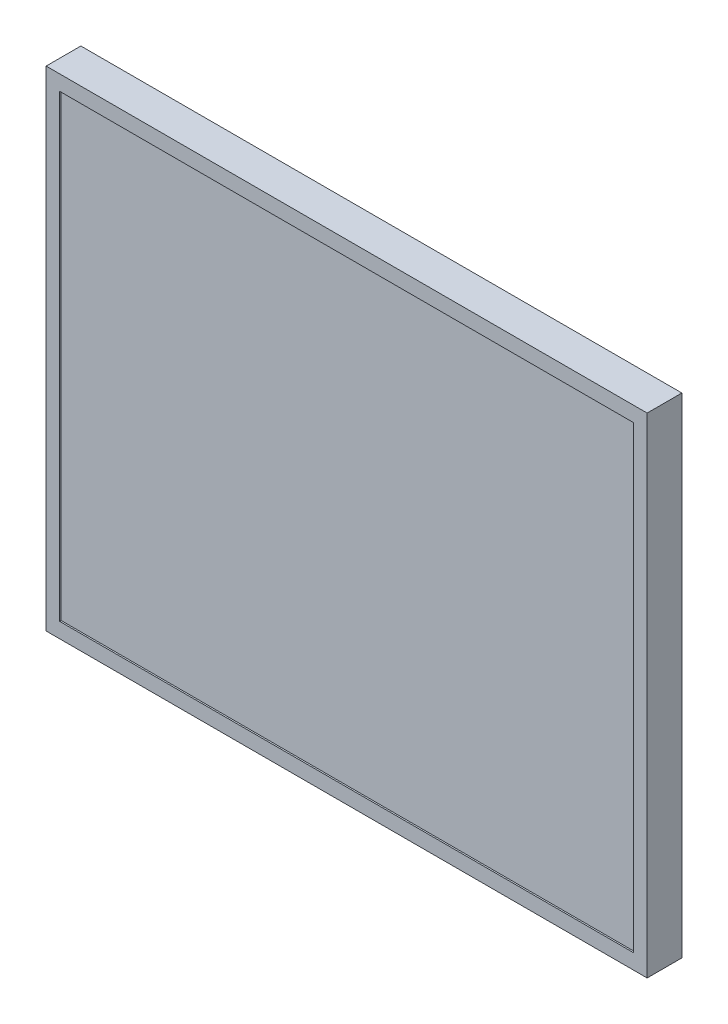
ISO-10303-21;
HEADER;
FILE_DESCRIPTION(('STEP AP214'),'2;1');
FILE_NAME('part.step','',(''),(''),'','','');
FILE_SCHEMA(('AUTOMOTIVE_DESIGN { 1 0 10303 214 1 1 1 1 }'));
ENDSEC;
DATA;
#1=APPLICATION_CONTEXT('core data for automotive mechanical design processes');
#2=APPLICATION_PROTOCOL_DEFINITION('international standard','automotive_design',2000,#1);
#3=PRODUCT_CONTEXT('',#1,'mechanical');
#4=PRODUCT('Part','Part','',(#3));
#5=PRODUCT_RELATED_PRODUCT_CATEGORY('part','',(#4));
#6=PRODUCT_DEFINITION_FORMATION('','',#4);
#7=PRODUCT_DEFINITION_CONTEXT('part definition',#1,'design');
#8=PRODUCT_DEFINITION('design','',#6,#7);
#9=PRODUCT_DEFINITION_SHAPE('','',#8);
#10=(LENGTH_UNIT() NAMED_UNIT(*) SI_UNIT(.MILLI.,.METRE.));
#11=(NAMED_UNIT(*) PLANE_ANGLE_UNIT() SI_UNIT($,.RADIAN.));
#12=(NAMED_UNIT(*) SI_UNIT($,.STERADIAN.) SOLID_ANGLE_UNIT());
#13=UNCERTAINTY_MEASURE_WITH_UNIT(LENGTH_MEASURE(1.E-05),#10,'distance_accuracy_value','');
#14=(GEOMETRIC_REPRESENTATION_CONTEXT(3) GLOBAL_UNCERTAINTY_ASSIGNED_CONTEXT((#13)) GLOBAL_UNIT_ASSIGNED_CONTEXT((#10,
#11,#12)) REPRESENTATION_CONTEXT('',''));
#15=CARTESIAN_POINT('',(0.,0.,0.));
#16=DIRECTION('',(0.,0.,1.));
#17=DIRECTION('',(1.,0.,0.));
#18=AXIS2_PLACEMENT_3D('',#15,#16,#17);
#19=CARTESIAN_POINT('',(374.,79.,-30.));
#20=DIRECTION('',(0.,1.,0.));
#21=DIRECTION('',(0.,0.,1.));
#22=AXIS2_PLACEMENT_3D('',#19,#20,#21);
#23=PLANE('',#22);
#24=DIRECTION('',(0.,0.,-1.));
#25=VECTOR('',#24,1.);
#26=CARTESIAN_POINT('',(99.,79.,-20.));
#27=LINE('',#26,#25);
#28=CARTESIAN_POINT('',(99.,79.,-10.));
#29=VERTEX_POINT('',#28);
#30=CARTESIAN_POINT('',(98.9999999999999,79.,-20.));
#31=VERTEX_POINT('',#30);
#32=EDGE_CURVE('E281',#29,#31,#27,.T.);
#33=ORIENTED_EDGE('',*,*,#32,.F.);
#34=DIRECTION('',(-1.,0.,0.));
#35=VECTOR('',#34,1.);
#36=CARTESIAN_POINT('',(99.,79.,-10.));
#37=LINE('',#36,#35);
#38=CARTESIAN_POINT('',(134.,79.,-9.99999999999999));
#39=VERTEX_POINT('',#38);
#40=EDGE_CURVE('E286',#39,#29,#37,.T.);
#41=ORIENTED_EDGE('',*,*,#40,.F.);
#42=DIRECTION('',(0.,0.,1.));
#43=VECTOR('',#42,1.);
#44=CARTESIAN_POINT('',(134.,79.,-20.));
#45=LINE('',#44,#43);
#46=CARTESIAN_POINT('',(134.,79.,-20.));
#47=VERTEX_POINT('',#46);
#48=EDGE_CURVE('E298',#47,#39,#45,.T.);
#49=ORIENTED_EDGE('',*,*,#48,.F.);
#50=DIRECTION('',(1.,0.,0.));
#51=VECTOR('',#50,1.);
#52=CARTESIAN_POINT('',(99.,79.,-20.));
#53=LINE('',#52,#51);
#54=EDGE_CURVE('E295',#31,#47,#53,.T.);
#55=ORIENTED_EDGE('',*,*,#54,.F.);
#56=EDGE_LOOP('',(#33,#41,#49,#55));
#57=FACE_BOUND('',#56,.T.);
#58=DIRECTION('',(-1.,0.,0.));
#59=VECTOR('',#58,1.);
#60=CARTESIAN_POINT('',(374.,79.,-30.));
#61=LINE('',#60,#59);
#62=CARTESIAN_POINT('',(344.,79.,-30.));
#63=VERTEX_POINT('',#62);
#64=CARTESIAN_POINT('',(52.,79.,-30.));
#65=VERTEX_POINT('',#64);
#66=EDGE_CURVE('E348',#63,#65,#61,.T.);
#67=ORIENTED_EDGE('',*,*,#66,.F.);
#68=DIRECTION('',(-0.832050294337844,0.,-0.554700196225228));
#69=VECTOR('',#68,1.);
#70=CARTESIAN_POINT('',(344.,79.,-30.));
#71=LINE('',#70,#69);
#72=CARTESIAN_POINT('',(374.,79.,-9.99999999999998));
#73=VERTEX_POINT('',#72);
#74=EDGE_CURVE('E440',#63,#73,#71,.F.);
#75=ORIENTED_EDGE('',*,*,#74,.T.);
#76=DIRECTION('',(0.,0.,1.));
#77=VECTOR('',#76,1.);
#78=CARTESIAN_POINT('',(374.,79.,-30.));
#79=LINE('',#78,#77);
#80=CARTESIAN_POINT('',(374.,79.,0.));
#81=VERTEX_POINT('',#80);
#82=EDGE_CURVE('E373',#73,#81,#79,.T.);
#83=ORIENTED_EDGE('',*,*,#82,.T.);
#84=DIRECTION('',(-1.,0.,0.));
#85=VECTOR('',#84,1.);
#86=CARTESIAN_POINT('',(374.,79.,0.));
#87=LINE('',#86,#85);
#88=CARTESIAN_POINT('',(52.,79.,0.));
#89=VERTEX_POINT('',#88);
#90=EDGE_CURVE('E360',#81,#89,#87,.T.);
#91=ORIENTED_EDGE('',*,*,#90,.T.);
#92=DIRECTION('',(0.,0.,1.));
#93=VECTOR('',#92,1.);
#94=CARTESIAN_POINT('',(52.,79.,-30.));
#95=LINE('',#94,#93);
#96=EDGE_CURVE('E370',#65,#89,#95,.T.);
#97=ORIENTED_EDGE('',*,*,#96,.F.);
#98=EDGE_LOOP('',(#67,#75,#83,#91,#97));
#99=FACE_BOUND('',#98,.T.);
#100=DIRECTION('',(0.,0.,-1.));
#101=VECTOR('',#100,1.);
#102=CARTESIAN_POINT('',(54.,79.,-20.));
#103=LINE('',#102,#101);
#104=CARTESIAN_POINT('',(54.,79.,-10.));
#105=VERTEX_POINT('',#104);
#106=CARTESIAN_POINT('',(54.,79.,-20.));
#107=VERTEX_POINT('',#106);
#108=EDGE_CURVE('E314',#105,#107,#103,.T.);
#109=ORIENTED_EDGE('',*,*,#108,.F.);
#110=DIRECTION('',(-1.,0.,0.));
#111=VECTOR('',#110,1.);
#112=CARTESIAN_POINT('',(54.,79.,-10.));
#113=LINE('',#112,#111);
#114=CARTESIAN_POINT('',(84.,79.,-9.99999999999999));
#115=VERTEX_POINT('',#114);
#116=EDGE_CURVE('E319',#115,#105,#113,.T.);
#117=ORIENTED_EDGE('',*,*,#116,.F.);
#118=DIRECTION('',(0.,0.,1.));
#119=VECTOR('',#118,1.);
#120=CARTESIAN_POINT('',(84.,79.,-20.));
#121=LINE('',#120,#119);
#122=CARTESIAN_POINT('',(84.,79.,-20.));
#123=VERTEX_POINT('',#122);
#124=EDGE_CURVE('E331',#123,#115,#121,.T.);
#125=ORIENTED_EDGE('',*,*,#124,.F.);
#126=DIRECTION('',(1.,0.,0.));
#127=VECTOR('',#126,1.);
#128=CARTESIAN_POINT('',(54.,79.,-20.));
#129=LINE('',#128,#127);
#130=EDGE_CURVE('E328',#107,#123,#129,.T.);
#131=ORIENTED_EDGE('',*,*,#130,.F.);
#132=EDGE_LOOP('',(#109,#117,#125,#131));
#133=FACE_BOUND('',#132,.T.);
#134=DIRECTION('',(0.,0.,1.));
#135=VECTOR('',#134,1.);
#136=CARTESIAN_POINT('',(319.,79.,-28.));
#137=LINE('',#136,#135);
#138=CARTESIAN_POINT('',(319.,79.,-28.));
#139=VERTEX_POINT('',#138);
#140=CARTESIAN_POINT('',(319.,79.,-2.));
#141=VERTEX_POINT('',#140);
#142=EDGE_CURVE('E261',#139,#141,#137,.T.);
#143=ORIENTED_EDGE('',*,*,#142,.F.);
#144=DIRECTION('',(1.,0.,0.));
#145=VECTOR('',#144,1.);
#146=CARTESIAN_POINT('',(319.,79.,-28.));
#147=LINE('',#146,#145);
#148=CARTESIAN_POINT('',(289.,79.,-28.));
#149=VERTEX_POINT('',#148);
#150=EDGE_CURVE('E254',#149,#139,#147,.T.);
#151=ORIENTED_EDGE('',*,*,#150,.F.);
#152=DIRECTION('',(0.,0.,-1.));
#153=VECTOR('',#152,1.);
#154=CARTESIAN_POINT('',(289.,79.,-28.));
#155=LINE('',#154,#153);
#156=CARTESIAN_POINT('',(289.,79.,-2.));
#157=VERTEX_POINT('',#156);
#158=EDGE_CURVE('E266',#157,#149,#155,.T.);
#159=ORIENTED_EDGE('',*,*,#158,.F.);
#160=DIRECTION('',(-1.,0.,0.));
#161=VECTOR('',#160,1.);
#162=CARTESIAN_POINT('',(319.,79.,-2.));
#163=LINE('',#162,#161);
#164=EDGE_CURVE('E55',#141,#157,#163,.T.);
#165=ORIENTED_EDGE('',*,*,#164,.F.);
#166=EDGE_LOOP('',(#143,#151,#159,#165));
#167=FACE_BOUND('',#166,.T.);
#168=ADVANCED_FACE('F32',(#57,#99,#133,#167),#23,.F.);
#169=CARTESIAN_POINT('',(0.,0.,0.));
#170=DIRECTION('',(0.,0.,-1.));
#171=DIRECTION('',(-1.,0.,0.));
#172=AXIS2_PLACEMENT_3D('',#169,#170,#171);
#173=PLANE('',#172);
#174=DIRECTION('',(0.,-1.,0.));
#175=VECTOR('',#174,1.);
#176=CARTESIAN_POINT('',(0.,0.,0.));
#177=LINE('',#176,#175);
#178=CARTESIAN_POINT('',(0.,324.,0.));
#179=VERTEX_POINT('',#178);
#180=CARTESIAN_POINT('',(0.,0.,0.));
#181=VERTEX_POINT('',#180);
#182=EDGE_CURVE('E401',#179,#181,#177,.T.);
#183=ORIENTED_EDGE('',*,*,#182,.F.);
#184=DIRECTION('',(-1.,0.,0.));
#185=VECTOR('',#184,1.);
#186=CARTESIAN_POINT('',(0.,324.,0.));
#187=LINE('',#186,#185);
#188=CARTESIAN_POINT('',(398.,324.,0.));
#189=VERTEX_POINT('',#188);
#190=EDGE_CURVE('E412',#189,#179,#187,.T.);
#191=ORIENTED_EDGE('',*,*,#190,.F.);
#192=DIRECTION('',(0.,1.,0.));
#193=VECTOR('',#192,1.);
#194=CARTESIAN_POINT('',(398.,0.,0.));
#195=LINE('',#194,#193);
#196=CARTESIAN_POINT('',(398.,0.,0.));
#197=VERTEX_POINT('',#196);
#198=EDGE_CURVE('E423',#197,#189,#195,.T.);
#199=ORIENTED_EDGE('',*,*,#198,.F.);
#200=DIRECTION('',(1.,0.,0.));
#201=VECTOR('',#200,1.);
#202=CARTESIAN_POINT('',(0.,0.,0.));
#203=LINE('',#202,#201);
#204=EDGE_CURVE('E421',#181,#197,#203,.T.);
#205=ORIENTED_EDGE('',*,*,#204,.F.);
#206=EDGE_LOOP('',(#183,#191,#199,#205));
#207=FACE_BOUND('',#206,.T.);
#208=ORIENTED_EDGE('',*,*,#90,.F.);
#209=DIRECTION('',(0.,-1.,0.));
#210=VECTOR('',#209,1.);
#211=CARTESIAN_POINT('',(374.,79.,0.));
#212=LINE('',#211,#210);
#213=CARTESIAN_POINT('',(374.,241.,0.));
#214=VERTEX_POINT('',#213);
#215=EDGE_CURVE('E347',#214,#81,#212,.T.);
#216=ORIENTED_EDGE('',*,*,#215,.F.);
#217=DIRECTION('',(1.,0.,0.));
#218=VECTOR('',#217,1.);
#219=CARTESIAN_POINT('',(374.,241.,0.));
#220=LINE('',#219,#218);
#221=CARTESIAN_POINT('',(52.,241.,0.));
#222=VERTEX_POINT('',#221);
#223=EDGE_CURVE('E350',#222,#214,#220,.T.);
#224=ORIENTED_EDGE('',*,*,#223,.F.);
#225=DIRECTION('',(0.,1.,0.));
#226=VECTOR('',#225,1.);
#227=CARTESIAN_POINT('',(52.,79.,0.));
#228=LINE('',#227,#226);
#229=EDGE_CURVE('E362',#89,#222,#228,.T.);
#230=ORIENTED_EDGE('',*,*,#229,.F.);
#231=EDGE_LOOP('',(#208,#216,#224,#230));
#232=FACE_BOUND('',#231,.T.);
#233=ADVANCED_FACE('F478',(#207,#232),#173,.T.);
#234=CARTESIAN_POINT('',(0.,0.,23.));
#235=DIRECTION('',(1.,0.,0.));
#236=DIRECTION('',(0.,0.,-1.));
#237=AXIS2_PLACEMENT_3D('',#234,#235,#236);
#238=PLANE('',#237);
#239=ORIENTED_EDGE('',*,*,#182,.T.);
#240=DIRECTION('',(0.,0.,-1.));
#241=VECTOR('',#240,1.);
#242=CARTESIAN_POINT('',(0.,0.,23.));
#243=LINE('',#242,#241);
#244=CARTESIAN_POINT('',(0.,0.,23.));
#245=VERTEX_POINT('',#244);
#246=EDGE_CURVE('E434',#245,#181,#243,.T.);
#247=ORIENTED_EDGE('',*,*,#246,.F.);
#248=DIRECTION('',(0.,-1.,0.));
#249=VECTOR('',#248,1.);
#250=CARTESIAN_POINT('',(0.,0.,23.));
#251=LINE('',#250,#249);
#252=CARTESIAN_POINT('',(0.,324.,23.));
#253=VERTEX_POINT('',#252);
#254=EDGE_CURVE('E408',#253,#245,#251,.T.);
#255=ORIENTED_EDGE('',*,*,#254,.F.);
#256=DIRECTION('',(0.,0.,-1.));
#257=VECTOR('',#256,1.);
#258=CARTESIAN_POINT('',(0.,324.,23.));
#259=LINE('',#258,#257);
#260=EDGE_CURVE('E418',#253,#179,#259,.T.);
#261=ORIENTED_EDGE('',*,*,#260,.T.);
#262=EDGE_LOOP('',(#239,#247,#255,#261));
#263=FACE_BOUND('',#262,.T.);
#264=ADVANCED_FACE('F480',(#263),#238,.F.);
#265=CARTESIAN_POINT('',(0.,0.,23.));
#266=DIRECTION('',(0.,1.,0.));
#267=DIRECTION('',(0.,0.,1.));
#268=AXIS2_PLACEMENT_3D('',#265,#266,#267);
#269=PLANE('',#268);
#270=ORIENTED_EDGE('',*,*,#204,.T.);
#271=DIRECTION('',(0.,0.,-1.));
#272=VECTOR('',#271,1.);
#273=CARTESIAN_POINT('',(398.,0.,23.));
#274=LINE('',#273,#272);
#275=CARTESIAN_POINT('',(398.,0.,23.));
#276=VERTEX_POINT('',#275);
#277=EDGE_CURVE('E431',#276,#197,#274,.T.);
#278=ORIENTED_EDGE('',*,*,#277,.F.);
#279=DIRECTION('',(1.,0.,0.));
#280=VECTOR('',#279,1.);
#281=CARTESIAN_POINT('',(0.,0.,23.));
#282=LINE('',#281,#280);
#283=EDGE_CURVE('E411',#245,#276,#282,.T.);
#284=ORIENTED_EDGE('',*,*,#283,.F.);
#285=ORIENTED_EDGE('',*,*,#246,.T.);
#286=EDGE_LOOP('',(#270,#278,#284,#285));
#287=FACE_BOUND('',#286,.T.);
#288=ADVANCED_FACE('F487',(#287),#269,.F.);
#289=CARTESIAN_POINT('',(398.,0.,23.));
#290=DIRECTION('',(-1.,0.,0.));
#291=DIRECTION('',(0.,0.,1.));
#292=AXIS2_PLACEMENT_3D('',#289,#290,#291);
#293=PLANE('',#292);
#294=ORIENTED_EDGE('',*,*,#198,.T.);
#295=DIRECTION('',(0.,0.,-1.));
#296=VECTOR('',#295,1.);
#297=CARTESIAN_POINT('',(398.,324.,23.));
#298=LINE('',#297,#296);
#299=CARTESIAN_POINT('',(398.,324.,23.));
#300=VERTEX_POINT('',#299);
#301=EDGE_CURVE('E428',#300,#189,#298,.T.);
#302=ORIENTED_EDGE('',*,*,#301,.F.);
#303=DIRECTION('',(0.,1.,0.));
#304=VECTOR('',#303,1.);
#305=CARTESIAN_POINT('',(398.,0.,23.));
#306=LINE('',#305,#304);
#307=EDGE_CURVE('E414',#276,#300,#306,.T.);
#308=ORIENTED_EDGE('',*,*,#307,.F.);
#309=ORIENTED_EDGE('',*,*,#277,.T.);
#310=EDGE_LOOP('',(#294,#302,#308,#309));
#311=FACE_BOUND('',#310,.T.);
#312=ADVANCED_FACE('F499',(#311),#293,.F.);
#313=CARTESIAN_POINT('',(0.,324.,23.));
#314=DIRECTION('',(0.,-1.,0.));
#315=DIRECTION('',(0.,0.,-1.));
#316=AXIS2_PLACEMENT_3D('',#313,#314,#315);
#317=PLANE('',#316);
#318=ORIENTED_EDGE('',*,*,#190,.T.);
#319=ORIENTED_EDGE('',*,*,#260,.F.);
#320=DIRECTION('',(-1.,0.,0.));
#321=VECTOR('',#320,1.);
#322=CARTESIAN_POINT('',(0.,324.,23.));
#323=LINE('',#322,#321);
#324=EDGE_CURVE('E416',#300,#253,#323,.T.);
#325=ORIENTED_EDGE('',*,*,#324,.F.);
#326=ORIENTED_EDGE('',*,*,#301,.T.);
#327=EDGE_LOOP('',(#318,#319,#325,#326));
#328=FACE_BOUND('',#327,.T.);
#329=ADVANCED_FACE('F496',(#328),#317,.F.);
#330=CARTESIAN_POINT('',(0.,0.,23.));
#331=DIRECTION('',(0.,0.,-1.));
#332=DIRECTION('',(-1.,0.,0.));
#333=AXIS2_PLACEMENT_3D('',#330,#331,#332);
#334=PLANE('',#333);
#335=DIRECTION('',(1.,0.,0.));
#336=VECTOR('',#335,1.);
#337=CARTESIAN_POINT('',(9.,10.,23.));
#338=LINE('',#337,#336);
#339=CARTESIAN_POINT('',(9.,10.,23.));
#340=VERTEX_POINT('',#339);
#341=CARTESIAN_POINT('',(389.,10.,23.));
#342=VERTEX_POINT('',#341);
#343=EDGE_CURVE('E391',#340,#342,#338,.T.);
#344=ORIENTED_EDGE('',*,*,#343,.F.);
#345=DIRECTION('',(0.,-1.,0.));
#346=VECTOR('',#345,1.);
#347=CARTESIAN_POINT('',(9.,10.,23.));
#348=LINE('',#347,#346);
#349=CARTESIAN_POINT('',(9.,314.,23.));
#350=VERTEX_POINT('',#349);
#351=EDGE_CURVE('E375',#350,#340,#348,.T.);
#352=ORIENTED_EDGE('',*,*,#351,.F.);
#353=DIRECTION('',(-1.,0.,0.));
#354=VECTOR('',#353,1.);
#355=CARTESIAN_POINT('',(9.,314.,23.));
#356=LINE('',#355,#354);
#357=CARTESIAN_POINT('',(389.,314.,23.));
#358=VERTEX_POINT('',#357);
#359=EDGE_CURVE('E380',#358,#350,#356,.T.);
#360=ORIENTED_EDGE('',*,*,#359,.F.);
#361=DIRECTION('',(0.,1.,0.));
#362=VECTOR('',#361,1.);
#363=CARTESIAN_POINT('',(389.,10.,23.));
#364=LINE('',#363,#362);
#365=EDGE_CURVE('E394',#342,#358,#364,.T.);
#366=ORIENTED_EDGE('',*,*,#365,.F.);
#367=EDGE_LOOP('',(#344,#352,#360,#366));
#368=FACE_BOUND('',#367,.T.);
#369=ORIENTED_EDGE('',*,*,#254,.T.);
#370=ORIENTED_EDGE('',*,*,#283,.T.);
#371=ORIENTED_EDGE('',*,*,#307,.T.);
#372=ORIENTED_EDGE('',*,*,#324,.T.);
#373=EDGE_LOOP('',(#369,#370,#371,#372));
#374=FACE_BOUND('',#373,.T.);
#375=ADVANCED_FACE('F494',(#368,#374),#334,.F.);
#376=CARTESIAN_POINT('',(9.,10.,22.));
#377=DIRECTION('',(-1.,0.,0.));
#378=DIRECTION('',(0.,0.,1.));
#379=AXIS2_PLACEMENT_3D('',#376,#377,#378);
#380=PLANE('',#379);
#381=ORIENTED_EDGE('',*,*,#351,.T.);
#382=DIRECTION('',(0.,0.,1.));
#383=VECTOR('',#382,1.);
#384=CARTESIAN_POINT('',(9.,10.,22.));
#385=LINE('',#384,#383);
#386=CARTESIAN_POINT('',(9.,10.,22.));
#387=VERTEX_POINT('',#386);
#388=EDGE_CURVE('E389',#387,#340,#385,.T.);
#389=ORIENTED_EDGE('',*,*,#388,.F.);
#390=DIRECTION('',(0.,-1.,0.));
#391=VECTOR('',#390,1.);
#392=CARTESIAN_POINT('',(9.,10.,22.));
#393=LINE('',#392,#391);
#394=CARTESIAN_POINT('',(9.,314.,22.));
#395=VERTEX_POINT('',#394);
#396=EDGE_CURVE('E376',#395,#387,#393,.T.);
#397=ORIENTED_EDGE('',*,*,#396,.F.);
#398=DIRECTION('',(0.,0.,1.));
#399=VECTOR('',#398,1.);
#400=CARTESIAN_POINT('',(9.,314.,22.));
#401=LINE('',#400,#399);
#402=EDGE_CURVE('E399',#395,#350,#401,.T.);
#403=ORIENTED_EDGE('',*,*,#402,.T.);
#404=EDGE_LOOP('',(#381,#389,#397,#403));
#405=FACE_BOUND('',#404,.T.);
#406=ADVANCED_FACE('F519',(#405),#380,.F.);
#407=CARTESIAN_POINT('',(9.,314.,22.));
#408=DIRECTION('',(0.,1.,0.));
#409=DIRECTION('',(0.,0.,1.));
#410=AXIS2_PLACEMENT_3D('',#407,#408,#409);
#411=PLANE('',#410);
#412=ORIENTED_EDGE('',*,*,#359,.T.);
#413=ORIENTED_EDGE('',*,*,#402,.F.);
#414=DIRECTION('',(-1.,0.,0.));
#415=VECTOR('',#414,1.);
#416=CARTESIAN_POINT('',(9.,314.,22.));
#417=LINE('',#416,#415);
#418=CARTESIAN_POINT('',(389.,314.,22.));
#419=VERTEX_POINT('',#418);
#420=EDGE_CURVE('E386',#419,#395,#417,.T.);
#421=ORIENTED_EDGE('',*,*,#420,.F.);
#422=DIRECTION('',(0.,0.,1.));
#423=VECTOR('',#422,1.);
#424=CARTESIAN_POINT('',(389.,314.,22.));
#425=LINE('',#424,#423);
#426=EDGE_CURVE('E402',#419,#358,#425,.T.);
#427=ORIENTED_EDGE('',*,*,#426,.T.);
#428=EDGE_LOOP('',(#412,#413,#421,#427));
#429=FACE_BOUND('',#428,.T.);
#430=ADVANCED_FACE('F524',(#429),#411,.F.);
#431=CARTESIAN_POINT('',(389.,10.,22.));
#432=DIRECTION('',(1.,0.,0.));
#433=DIRECTION('',(0.,0.,-1.));
#434=AXIS2_PLACEMENT_3D('',#431,#432,#433);
#435=PLANE('',#434);
#436=ORIENTED_EDGE('',*,*,#365,.T.);
#437=ORIENTED_EDGE('',*,*,#426,.F.);
#438=DIRECTION('',(0.,1.,0.));
#439=VECTOR('',#438,1.);
#440=CARTESIAN_POINT('',(389.,10.,22.));
#441=LINE('',#440,#439);
#442=CARTESIAN_POINT('',(389.,10.,22.));
#443=VERTEX_POINT('',#442);
#444=EDGE_CURVE('E383',#443,#419,#441,.T.);
#445=ORIENTED_EDGE('',*,*,#444,.F.);
#446=DIRECTION('',(0.,0.,1.));
#447=VECTOR('',#446,1.);
#448=CARTESIAN_POINT('',(389.,10.,22.));
#449=LINE('',#448,#447);
#450=EDGE_CURVE('E404',#443,#342,#449,.T.);
#451=ORIENTED_EDGE('',*,*,#450,.T.);
#452=EDGE_LOOP('',(#436,#437,#445,#451));
#453=FACE_BOUND('',#452,.T.);
#454=ADVANCED_FACE('F538',(#453),#435,.F.);
#455=CARTESIAN_POINT('',(9.,10.,22.));
#456=DIRECTION('',(0.,-1.,0.));
#457=DIRECTION('',(0.,0.,-1.));
#458=AXIS2_PLACEMENT_3D('',#455,#456,#457);
#459=PLANE('',#458);
#460=ORIENTED_EDGE('',*,*,#343,.T.);
#461=ORIENTED_EDGE('',*,*,#450,.F.);
#462=DIRECTION('',(1.,0.,0.));
#463=VECTOR('',#462,1.);
#464=CARTESIAN_POINT('',(9.,10.,22.));
#465=LINE('',#464,#463);
#466=EDGE_CURVE('E379',#387,#443,#465,.T.);
#467=ORIENTED_EDGE('',*,*,#466,.F.);
#468=ORIENTED_EDGE('',*,*,#388,.T.);
#469=EDGE_LOOP('',(#460,#461,#467,#468));
#470=FACE_BOUND('',#469,.T.);
#471=ADVANCED_FACE('F531',(#470),#459,.F.);
#472=CARTESIAN_POINT('',(0.,0.,22.));
#473=DIRECTION('',(0.,0.,-1.));
#474=DIRECTION('',(-1.,0.,0.));
#475=AXIS2_PLACEMENT_3D('',#472,#473,#474);
#476=PLANE('',#475);
#477=ORIENTED_EDGE('',*,*,#396,.T.);
#478=ORIENTED_EDGE('',*,*,#466,.T.);
#479=ORIENTED_EDGE('',*,*,#444,.T.);
#480=ORIENTED_EDGE('',*,*,#420,.T.);
#481=EDGE_LOOP('',(#477,#478,#479,#480));
#482=FACE_BOUND('',#481,.T.);
#483=ADVANCED_FACE('F540',(#482),#476,.F.);
#484=CARTESIAN_POINT('',(374.,79.,-30.));
#485=DIRECTION('',(-1.,0.,0.));
#486=DIRECTION('',(0.,0.,1.));
#487=AXIS2_PLACEMENT_3D('',#484,#485,#486);
#488=PLANE('',#487);
#489=ORIENTED_EDGE('',*,*,#82,.F.);
#490=DIRECTION('',(0.,1.,0.));
#491=VECTOR('',#490,1.);
#492=CARTESIAN_POINT('',(374.,79.,-9.99999999999998));
#493=LINE('',#492,#491);
#494=CARTESIAN_POINT('',(374.,241.,-9.99999999999998));
#495=VERTEX_POINT('',#494);
#496=EDGE_CURVE('E40',#73,#495,#493,.T.);
#497=ORIENTED_EDGE('',*,*,#496,.T.);
#498=DIRECTION('',(0.,0.,1.));
#499=VECTOR('',#498,1.);
#500=CARTESIAN_POINT('',(374.,241.,-30.));
#501=LINE('',#500,#499);
#502=EDGE_CURVE('E357',#495,#214,#501,.T.);
#503=ORIENTED_EDGE('',*,*,#502,.T.);
#504=ORIENTED_EDGE('',*,*,#215,.T.);
#505=EDGE_LOOP('',(#489,#497,#503,#504));
#506=FACE_BOUND('',#505,.T.);
#507=ADVANCED_FACE('F445',(#506),#488,.F.);
#508=CARTESIAN_POINT('',(52.,79.,-30.));
#509=DIRECTION('',(1.,0.,0.));
#510=DIRECTION('',(0.,0.,-1.));
#511=AXIS2_PLACEMENT_3D('',#508,#509,#510);
#512=PLANE('',#511);
#513=DIRECTION('',(0.,1.,0.));
#514=VECTOR('',#513,1.);
#515=CARTESIAN_POINT('',(52.,106.,-5.));
#516=LINE('',#515,#514);
#517=CARTESIAN_POINT('',(52.,106.,-5.));
#518=VERTEX_POINT('',#517);
#519=CARTESIAN_POINT('',(52.,135.,-5.));
#520=VERTEX_POINT('',#519);
#521=EDGE_CURVE('E229',#518,#520,#516,.T.);
#522=ORIENTED_EDGE('',*,*,#521,.F.);
#523=DIRECTION('',(0.,0.,-1.));
#524=VECTOR('',#523,1.);
#525=CARTESIAN_POINT('',(52.,106.,-5.));
#526=LINE('',#525,#524);
#527=CARTESIAN_POINT('',(52.,106.,-30.));
#528=VERTEX_POINT('',#527);
#529=EDGE_CURVE('E264',#518,#528,#526,.T.);
#530=ORIENTED_EDGE('',*,*,#529,.T.);
#531=DIRECTION('',(0.,1.,0.));
#532=VECTOR('',#531,1.);
#533=CARTESIAN_POINT('',(52.,79.,-30.));
#534=LINE('',#533,#532);
#535=EDGE_CURVE('E351',#65,#528,#534,.T.);
#536=ORIENTED_EDGE('',*,*,#535,.F.);
#537=ORIENTED_EDGE('',*,*,#96,.T.);
#538=ORIENTED_EDGE('',*,*,#229,.T.);
#539=DIRECTION('',(0.,0.,1.));
#540=VECTOR('',#539,1.);
#541=CARTESIAN_POINT('',(52.,241.,-30.));
#542=LINE('',#541,#540);
#543=CARTESIAN_POINT('',(52.,241.,-30.));
#544=VERTEX_POINT('',#543);
#545=EDGE_CURVE('E368',#544,#222,#542,.T.);
#546=ORIENTED_EDGE('',*,*,#545,.F.);
#547=CARTESIAN_POINT('',(52.,135.,-30.));
#548=VERTEX_POINT('',#547);
#549=EDGE_CURVE('E243',#548,#544,#534,.T.);
#550=ORIENTED_EDGE('',*,*,#549,.F.);
#551=DIRECTION('',(0.,0.,-1.));
#552=VECTOR('',#551,1.);
#553=CARTESIAN_POINT('',(52.,135.,-5.));
#554=LINE('',#553,#552);
#555=EDGE_CURVE('E47',#520,#548,#554,.T.);
#556=ORIENTED_EDGE('',*,*,#555,.F.);
#557=EDGE_LOOP('',(#522,#530,#536,#537,#538,#546,#550,#556));
#558=FACE_BOUND('',#557,.T.);
#559=ADVANCED_FACE('F241',(#558),#512,.F.);
#560=CARTESIAN_POINT('',(374.,241.,-30.));
#561=DIRECTION('',(0.,-1.,0.));
#562=DIRECTION('',(0.,0.,-1.));
#563=AXIS2_PLACEMENT_3D('',#560,#561,#562);
#564=PLANE('',#563);
#565=ORIENTED_EDGE('',*,*,#502,.F.);
#566=DIRECTION('',(0.832050294337844,0.,0.554700196225228));
#567=VECTOR('',#566,1.);
#568=CARTESIAN_POINT('',(344.,241.,-30.));
#569=LINE('',#568,#567);
#570=CARTESIAN_POINT('',(344.,241.,-30.));
#571=VERTEX_POINT('',#570);
#572=EDGE_CURVE('E11',#495,#571,#569,.F.);
#573=ORIENTED_EDGE('',*,*,#572,.T.);
#574=DIRECTION('',(1.,0.,0.));
#575=VECTOR('',#574,1.);
#576=CARTESIAN_POINT('',(374.,241.,-30.));
#577=LINE('',#576,#575);
#578=EDGE_CURVE('E354',#544,#571,#577,.T.);
#579=ORIENTED_EDGE('',*,*,#578,.F.);
#580=ORIENTED_EDGE('',*,*,#545,.T.);
#581=ORIENTED_EDGE('',*,*,#223,.T.);
#582=EDGE_LOOP('',(#565,#573,#579,#580,#581));
#583=FACE_BOUND('',#582,.T.);
#584=ADVANCED_FACE('F449',(#583),#564,.F.);
#585=CARTESIAN_POINT('',(0.,0.,-30.));
#586=DIRECTION('',(0.,0.,1.));
#587=DIRECTION('',(1.,0.,0.));
#588=AXIS2_PLACEMENT_3D('',#585,#586,#587);
#589=PLANE('',#588);
#590=ORIENTED_EDGE('',*,*,#535,.T.);
#591=DIRECTION('',(-1.,0.,0.));
#592=VECTOR('',#591,1.);
#593=CARTESIAN_POINT('',(52.,106.,-30.));
#594=LINE('',#593,#592);
#595=CARTESIAN_POINT('',(67.,106.,-30.));
#596=VERTEX_POINT('',#595);
#597=EDGE_CURVE('E238',#596,#528,#594,.T.);
#598=ORIENTED_EDGE('',*,*,#597,.F.);
#599=DIRECTION('',(0.,-1.,0.));
#600=VECTOR('',#599,1.);
#601=CARTESIAN_POINT('',(67.,106.,-30.));
#602=LINE('',#601,#600);
#603=CARTESIAN_POINT('',(67.,135.,-30.));
#604=VERTEX_POINT('',#603);
#605=EDGE_CURVE('E466',#604,#596,#602,.T.);
#606=ORIENTED_EDGE('',*,*,#605,.F.);
#607=DIRECTION('',(1.,0.,0.));
#608=VECTOR('',#607,1.);
#609=CARTESIAN_POINT('',(52.,135.,-30.));
#610=LINE('',#609,#608);
#611=EDGE_CURVE('E469',#548,#604,#610,.T.);
#612=ORIENTED_EDGE('',*,*,#611,.F.);
#613=ORIENTED_EDGE('',*,*,#549,.T.);
#614=ORIENTED_EDGE('',*,*,#578,.T.);
#615=DIRECTION('',(0.,-1.,0.));
#616=VECTOR('',#615,1.);
#617=CARTESIAN_POINT('',(344.,0.,-30.));
#618=LINE('',#617,#616);
#619=EDGE_CURVE('E437',#571,#63,#618,.T.);
#620=ORIENTED_EDGE('',*,*,#619,.T.);
#621=ORIENTED_EDGE('',*,*,#66,.T.);
#622=EDGE_LOOP('',(#590,#598,#606,#612,#613,#614,#620,#621));
#623=FACE_BOUND('',#622,.T.);
#624=ADVANCED_FACE('F456',(#623),#589,.F.);
#625=CARTESIAN_POINT('',(344.,0.,-30.));
#626=DIRECTION('',(-0.554700196225228,0.,0.832050294337845));
#627=DIRECTION('',(0.,-1.,0.));
#628=AXIS2_PLACEMENT_3D('',#625,#626,#627);
#629=PLANE('',#628);
#630=ORIENTED_EDGE('',*,*,#572,.F.);
#631=ORIENTED_EDGE('',*,*,#496,.F.);
#632=ORIENTED_EDGE('',*,*,#74,.F.);
#633=ORIENTED_EDGE('',*,*,#619,.F.);
#634=EDGE_LOOP('',(#630,#631,#632,#633));
#635=FACE_BOUND('',#634,.T.);
#636=ADVANCED_FACE('F34',(#635),#629,.F.);
#637=CARTESIAN_POINT('',(54.,69.,-20.));
#638=DIRECTION('',(1.,0.,0.));
#639=DIRECTION('',(0.,0.,-1.));
#640=AXIS2_PLACEMENT_3D('',#637,#638,#639);
#641=PLANE('',#640);
#642=ORIENTED_EDGE('',*,*,#108,.T.);
#643=DIRECTION('',(0.,1.,0.));
#644=VECTOR('',#643,1.);
#645=CARTESIAN_POINT('',(54.,69.,-20.));
#646=LINE('',#645,#644);
#647=CARTESIAN_POINT('',(54.,69.,-20.));
#648=VERTEX_POINT('',#647);
#649=EDGE_CURVE('E344',#648,#107,#646,.T.);
#650=ORIENTED_EDGE('',*,*,#649,.F.);
#651=DIRECTION('',(0.,0.,-1.));
#652=VECTOR('',#651,1.);
#653=CARTESIAN_POINT('',(54.,69.,-20.));
#654=LINE('',#653,#652);
#655=CARTESIAN_POINT('',(54.,69.,-10.));
#656=VERTEX_POINT('',#655);
#657=EDGE_CURVE('E315',#656,#648,#654,.T.);
#658=ORIENTED_EDGE('',*,*,#657,.F.);
#659=DIRECTION('',(0.,1.,0.));
#660=VECTOR('',#659,1.);
#661=CARTESIAN_POINT('',(54.,69.,-10.));
#662=LINE('',#661,#660);
#663=EDGE_CURVE('E325',#656,#105,#662,.T.);
#664=ORIENTED_EDGE('',*,*,#663,.T.);
#665=EDGE_LOOP('',(#642,#650,#658,#664));
#666=FACE_BOUND('',#665,.T.);
#667=ADVANCED_FACE('F596',(#666),#641,.F.);
#668=CARTESIAN_POINT('',(54.,69.,-20.));
#669=DIRECTION('',(0.,0.,1.));
#670=DIRECTION('',(1.,0.,0.));
#671=AXIS2_PLACEMENT_3D('',#668,#669,#670);
#672=PLANE('',#671);
#673=ORIENTED_EDGE('',*,*,#130,.T.);
#674=DIRECTION('',(0.,1.,0.));
#675=VECTOR('',#674,1.);
#676=CARTESIAN_POINT('',(84.,69.,-20.));
#677=LINE('',#676,#675);
#678=CARTESIAN_POINT('',(84.,69.,-20.));
#679=VERTEX_POINT('',#678);
#680=EDGE_CURVE('E341',#679,#123,#677,.T.);
#681=ORIENTED_EDGE('',*,*,#680,.F.);
#682=DIRECTION('',(1.,0.,0.));
#683=VECTOR('',#682,1.);
#684=CARTESIAN_POINT('',(54.,69.,-20.));
#685=LINE('',#684,#683);
#686=EDGE_CURVE('E318',#648,#679,#685,.T.);
#687=ORIENTED_EDGE('',*,*,#686,.F.);
#688=ORIENTED_EDGE('',*,*,#649,.T.);
#689=EDGE_LOOP('',(#673,#681,#687,#688));
#690=FACE_BOUND('',#689,.T.);
#691=ADVANCED_FACE('F610',(#690),#672,.F.);
#692=CARTESIAN_POINT('',(84.,69.,-20.));
#693=DIRECTION('',(-1.,0.,0.));
#694=DIRECTION('',(0.,0.,1.));
#695=AXIS2_PLACEMENT_3D('',#692,#693,#694);
#696=PLANE('',#695);
#697=ORIENTED_EDGE('',*,*,#124,.T.);
#698=DIRECTION('',(0.,1.,0.));
#699=VECTOR('',#698,1.);
#700=CARTESIAN_POINT('',(84.,69.,-10.));
#701=LINE('',#700,#699);
#702=CARTESIAN_POINT('',(84.,69.,-10.));
#703=VERTEX_POINT('',#702);
#704=EDGE_CURVE('E338',#703,#115,#701,.T.);
#705=ORIENTED_EDGE('',*,*,#704,.F.);
#706=DIRECTION('',(0.,0.,1.));
#707=VECTOR('',#706,1.);
#708=CARTESIAN_POINT('',(84.,69.,-20.));
#709=LINE('',#708,#707);
#710=EDGE_CURVE('E321',#679,#703,#709,.T.);
#711=ORIENTED_EDGE('',*,*,#710,.F.);
#712=ORIENTED_EDGE('',*,*,#680,.T.);
#713=EDGE_LOOP('',(#697,#705,#711,#712));
#714=FACE_BOUND('',#713,.T.);
#715=ADVANCED_FACE('F620',(#714),#696,.F.);
#716=CARTESIAN_POINT('',(54.,69.,-10.));
#717=DIRECTION('',(0.,0.,-1.));
#718=DIRECTION('',(-1.,0.,0.));
#719=AXIS2_PLACEMENT_3D('',#716,#717,#718);
#720=PLANE('',#719);
#721=ORIENTED_EDGE('',*,*,#116,.T.);
#722=ORIENTED_EDGE('',*,*,#663,.F.);
#723=DIRECTION('',(-1.,0.,0.));
#724=VECTOR('',#723,1.);
#725=CARTESIAN_POINT('',(54.,69.,-10.));
#726=LINE('',#725,#724);
#727=EDGE_CURVE('E323',#703,#656,#726,.T.);
#728=ORIENTED_EDGE('',*,*,#727,.F.);
#729=ORIENTED_EDGE('',*,*,#704,.T.);
#730=EDGE_LOOP('',(#721,#722,#728,#729));
#731=FACE_BOUND('',#730,.T.);
#732=ADVANCED_FACE('F630',(#731),#720,.F.);
#733=CARTESIAN_POINT('',(0.,69.,0.));
#734=DIRECTION('',(0.,1.,0.));
#735=DIRECTION('',(0.,0.,1.));
#736=AXIS2_PLACEMENT_3D('',#733,#734,#735);
#737=PLANE('',#736);
#738=ORIENTED_EDGE('',*,*,#657,.T.);
#739=ORIENTED_EDGE('',*,*,#686,.T.);
#740=ORIENTED_EDGE('',*,*,#710,.T.);
#741=ORIENTED_EDGE('',*,*,#727,.T.);
#742=EDGE_LOOP('',(#738,#739,#740,#741));
#743=FACE_BOUND('',#742,.T.);
#744=ADVANCED_FACE('F640',(#743),#737,.F.);
#745=CARTESIAN_POINT('',(99.,69.,-20.));
#746=DIRECTION('',(1.,0.,0.));
#747=DIRECTION('',(0.,0.,-1.));
#748=AXIS2_PLACEMENT_3D('',#745,#746,#747);
#749=PLANE('',#748);
#750=ORIENTED_EDGE('',*,*,#32,.T.);
#751=DIRECTION('',(0.,1.,0.));
#752=VECTOR('',#751,1.);
#753=CARTESIAN_POINT('',(99.,69.,-20.));
#754=LINE('',#753,#752);
#755=CARTESIAN_POINT('',(99.,69.,-20.));
#756=VERTEX_POINT('',#755);
#757=EDGE_CURVE('E311',#756,#31,#754,.T.);
#758=ORIENTED_EDGE('',*,*,#757,.F.);
#759=DIRECTION('',(0.,0.,-1.));
#760=VECTOR('',#759,1.);
#761=CARTESIAN_POINT('',(99.,69.,-20.));
#762=LINE('',#761,#760);
#763=CARTESIAN_POINT('',(99.,69.,-10.));
#764=VERTEX_POINT('',#763);
#765=EDGE_CURVE('E282',#764,#756,#762,.T.);
#766=ORIENTED_EDGE('',*,*,#765,.F.);
#767=DIRECTION('',(0.,1.,0.));
#768=VECTOR('',#767,1.);
#769=CARTESIAN_POINT('',(99.,69.,-10.));
#770=LINE('',#769,#768);
#771=EDGE_CURVE('E292',#764,#29,#770,.T.);
#772=ORIENTED_EDGE('',*,*,#771,.T.);
#773=EDGE_LOOP('',(#750,#758,#766,#772));
#774=FACE_BOUND('',#773,.T.);
#775=ADVANCED_FACE('F650',(#774),#749,.F.);
#776=CARTESIAN_POINT('',(99.,69.,-20.));
#777=DIRECTION('',(0.,0.,1.));
#778=DIRECTION('',(1.,0.,0.));
#779=AXIS2_PLACEMENT_3D('',#776,#777,#778);
#780=PLANE('',#779);
#781=ORIENTED_EDGE('',*,*,#54,.T.);
#782=DIRECTION('',(0.,1.,0.));
#783=VECTOR('',#782,1.);
#784=CARTESIAN_POINT('',(134.,69.,-20.));
#785=LINE('',#784,#783);
#786=CARTESIAN_POINT('',(134.,69.,-20.));
#787=VERTEX_POINT('',#786);
#788=EDGE_CURVE('E308',#787,#47,#785,.T.);
#789=ORIENTED_EDGE('',*,*,#788,.F.);
#790=DIRECTION('',(1.,0.,0.));
#791=VECTOR('',#790,1.);
#792=CARTESIAN_POINT('',(99.,69.,-20.));
#793=LINE('',#792,#791);
#794=EDGE_CURVE('E285',#756,#787,#793,.T.);
#795=ORIENTED_EDGE('',*,*,#794,.F.);
#796=ORIENTED_EDGE('',*,*,#757,.T.);
#797=EDGE_LOOP('',(#781,#789,#795,#796));
#798=FACE_BOUND('',#797,.T.);
#799=ADVANCED_FACE('F660',(#798),#780,.F.);
#800=CARTESIAN_POINT('',(134.,69.,-20.));
#801=DIRECTION('',(-1.,0.,0.));
#802=DIRECTION('',(0.,0.,1.));
#803=AXIS2_PLACEMENT_3D('',#800,#801,#802);
#804=PLANE('',#803);
#805=ORIENTED_EDGE('',*,*,#48,.T.);
#806=DIRECTION('',(0.,1.,0.));
#807=VECTOR('',#806,1.);
#808=CARTESIAN_POINT('',(134.,69.,-10.));
#809=LINE('',#808,#807);
#810=CARTESIAN_POINT('',(134.,69.,-10.));
#811=VERTEX_POINT('',#810);
#812=EDGE_CURVE('E305',#811,#39,#809,.T.);
#813=ORIENTED_EDGE('',*,*,#812,.F.);
#814=DIRECTION('',(0.,0.,1.));
#815=VECTOR('',#814,1.);
#816=CARTESIAN_POINT('',(134.,69.,-20.));
#817=LINE('',#816,#815);
#818=EDGE_CURVE('E288',#787,#811,#817,.T.);
#819=ORIENTED_EDGE('',*,*,#818,.F.);
#820=ORIENTED_EDGE('',*,*,#788,.T.);
#821=EDGE_LOOP('',(#805,#813,#819,#820));
#822=FACE_BOUND('',#821,.T.);
#823=ADVANCED_FACE('F670',(#822),#804,.F.);
#824=CARTESIAN_POINT('',(99.,69.,-10.));
#825=DIRECTION('',(0.,0.,-1.));
#826=DIRECTION('',(-1.,0.,0.));
#827=AXIS2_PLACEMENT_3D('',#824,#825,#826);
#828=PLANE('',#827);
#829=ORIENTED_EDGE('',*,*,#40,.T.);
#830=ORIENTED_EDGE('',*,*,#771,.F.);
#831=DIRECTION('',(-1.,0.,0.));
#832=VECTOR('',#831,1.);
#833=CARTESIAN_POINT('',(99.,69.,-10.));
#834=LINE('',#833,#832);
#835=EDGE_CURVE('E290',#811,#764,#834,.T.);
#836=ORIENTED_EDGE('',*,*,#835,.F.);
#837=ORIENTED_EDGE('',*,*,#812,.T.);
#838=EDGE_LOOP('',(#829,#830,#836,#837));
#839=FACE_BOUND('',#838,.T.);
#840=ADVANCED_FACE('F680',(#839),#828,.F.);
#841=CARTESIAN_POINT('',(0.,69.,0.));
#842=DIRECTION('',(0.,1.,0.));
#843=DIRECTION('',(0.,0.,1.));
#844=AXIS2_PLACEMENT_3D('',#841,#842,#843);
#845=PLANE('',#844);
#846=ORIENTED_EDGE('',*,*,#765,.T.);
#847=ORIENTED_EDGE('',*,*,#794,.T.);
#848=ORIENTED_EDGE('',*,*,#818,.T.);
#849=ORIENTED_EDGE('',*,*,#835,.T.);
#850=EDGE_LOOP('',(#846,#847,#848,#849));
#851=FACE_BOUND('',#850,.T.);
#852=ADVANCED_FACE('F690',(#851),#845,.F.);
#853=CARTESIAN_POINT('',(319.,69.,-28.));
#854=DIRECTION('',(-1.,0.,0.));
#855=DIRECTION('',(0.,0.,1.));
#856=AXIS2_PLACEMENT_3D('',#853,#854,#855);
#857=PLANE('',#856);
#858=ORIENTED_EDGE('',*,*,#142,.T.);
#859=DIRECTION('',(0.,1.,0.));
#860=VECTOR('',#859,1.);
#861=CARTESIAN_POINT('',(319.,69.,-2.));
#862=LINE('',#861,#860);
#863=CARTESIAN_POINT('',(319.,69.,-2.));
#864=VERTEX_POINT('',#863);
#865=EDGE_CURVE('E279',#864,#141,#862,.T.);
#866=ORIENTED_EDGE('',*,*,#865,.F.);
#867=DIRECTION('',(0.,0.,1.));
#868=VECTOR('',#867,1.);
#869=CARTESIAN_POINT('',(319.,69.,-28.));
#870=LINE('',#869,#868);
#871=CARTESIAN_POINT('',(319.,69.,-28.));
#872=VERTEX_POINT('',#871);
#873=EDGE_CURVE('E250',#872,#864,#870,.T.);
#874=ORIENTED_EDGE('',*,*,#873,.F.);
#875=DIRECTION('',(0.,1.,0.));
#876=VECTOR('',#875,1.);
#877=CARTESIAN_POINT('',(319.,69.,-28.));
#878=LINE('',#877,#876);
#879=EDGE_CURVE('E260',#872,#139,#878,.T.);
#880=ORIENTED_EDGE('',*,*,#879,.T.);
#881=EDGE_LOOP('',(#858,#866,#874,#880));
#882=FACE_BOUND('',#881,.T.);
#883=ADVANCED_FACE('F700',(#882),#857,.F.);
#884=CARTESIAN_POINT('',(319.,69.,-2.));
#885=DIRECTION('',(0.,0.,-1.));
#886=DIRECTION('',(-1.,0.,0.));
#887=AXIS2_PLACEMENT_3D('',#884,#885,#886);
#888=PLANE('',#887);
#889=ORIENTED_EDGE('',*,*,#164,.T.);
#890=DIRECTION('',(0.,1.,0.));
#891=VECTOR('',#890,1.);
#892=CARTESIAN_POINT('',(289.,69.,-2.));
#893=LINE('',#892,#891);
#894=CARTESIAN_POINT('',(289.,69.,-2.));
#895=VERTEX_POINT('',#894);
#896=EDGE_CURVE('E276',#895,#157,#893,.T.);
#897=ORIENTED_EDGE('',*,*,#896,.F.);
#898=DIRECTION('',(-1.,0.,0.));
#899=VECTOR('',#898,1.);
#900=CARTESIAN_POINT('',(319.,69.,-2.));
#901=LINE('',#900,#899);
#902=EDGE_CURVE('E253',#864,#895,#901,.T.);
#903=ORIENTED_EDGE('',*,*,#902,.F.);
#904=ORIENTED_EDGE('',*,*,#865,.T.);
#905=EDGE_LOOP('',(#889,#897,#903,#904));
#906=FACE_BOUND('',#905,.T.);
#907=ADVANCED_FACE('F710',(#906),#888,.F.);
#908=CARTESIAN_POINT('',(289.,69.,-28.));
#909=DIRECTION('',(1.,0.,0.));
#910=DIRECTION('',(0.,0.,-1.));
#911=AXIS2_PLACEMENT_3D('',#908,#909,#910);
#912=PLANE('',#911);
#913=ORIENTED_EDGE('',*,*,#158,.T.);
#914=DIRECTION('',(0.,1.,0.));
#915=VECTOR('',#914,1.);
#916=CARTESIAN_POINT('',(289.,69.,-28.));
#917=LINE('',#916,#915);
#918=CARTESIAN_POINT('',(289.,69.,-28.));
#919=VERTEX_POINT('',#918);
#920=EDGE_CURVE('E273',#919,#149,#917,.T.);
#921=ORIENTED_EDGE('',*,*,#920,.F.);
#922=DIRECTION('',(0.,0.,-1.));
#923=VECTOR('',#922,1.);
#924=CARTESIAN_POINT('',(289.,69.,-28.));
#925=LINE('',#924,#923);
#926=EDGE_CURVE('E256',#895,#919,#925,.T.);
#927=ORIENTED_EDGE('',*,*,#926,.F.);
#928=ORIENTED_EDGE('',*,*,#896,.T.);
#929=EDGE_LOOP('',(#913,#921,#927,#928));
#930=FACE_BOUND('',#929,.T.);
#931=ADVANCED_FACE('F720',(#930),#912,.F.);
#932=CARTESIAN_POINT('',(319.,69.,-28.));
#933=DIRECTION('',(0.,0.,1.));
#934=DIRECTION('',(1.,0.,0.));
#935=AXIS2_PLACEMENT_3D('',#932,#933,#934);
#936=PLANE('',#935);
#937=ORIENTED_EDGE('',*,*,#150,.T.);
#938=ORIENTED_EDGE('',*,*,#879,.F.);
#939=DIRECTION('',(1.,0.,0.));
#940=VECTOR('',#939,1.);
#941=CARTESIAN_POINT('',(319.,69.,-28.));
#942=LINE('',#941,#940);
#943=EDGE_CURVE('E258',#919,#872,#942,.T.);
#944=ORIENTED_EDGE('',*,*,#943,.F.);
#945=ORIENTED_EDGE('',*,*,#920,.T.);
#946=EDGE_LOOP('',(#937,#938,#944,#945));
#947=FACE_BOUND('',#946,.T.);
#948=ADVANCED_FACE('F730',(#947),#936,.F.);
#949=CARTESIAN_POINT('',(0.,69.,0.));
#950=DIRECTION('',(0.,-1.,0.));
#951=DIRECTION('',(0.,0.,-1.));
#952=AXIS2_PLACEMENT_3D('',#949,#950,#951);
#953=PLANE('',#952);
#954=ORIENTED_EDGE('',*,*,#873,.T.);
#955=ORIENTED_EDGE('',*,*,#902,.T.);
#956=ORIENTED_EDGE('',*,*,#926,.T.);
#957=ORIENTED_EDGE('',*,*,#943,.T.);
#958=EDGE_LOOP('',(#954,#955,#956,#957));
#959=FACE_BOUND('',#958,.T.);
#960=ADVANCED_FACE('F740',(#959),#953,.T.);
#961=CARTESIAN_POINT('',(52.,106.,-5.));
#962=DIRECTION('',(0.,-1.,0.));
#963=DIRECTION('',(0.,0.,-1.));
#964=AXIS2_PLACEMENT_3D('',#961,#962,#963);
#965=PLANE('',#964);
#966=ORIENTED_EDGE('',*,*,#597,.T.);
#967=ORIENTED_EDGE('',*,*,#529,.F.);
#968=DIRECTION('',(-1.,0.,0.));
#969=VECTOR('',#968,1.);
#970=CARTESIAN_POINT('',(52.,106.,-5.));
#971=LINE('',#970,#969);
#972=CARTESIAN_POINT('',(67.,106.,-5.));
#973=VERTEX_POINT('',#972);
#974=EDGE_CURVE('E235',#973,#518,#971,.T.);
#975=ORIENTED_EDGE('',*,*,#974,.F.);
#976=DIRECTION('',(0.,0.,-1.));
#977=VECTOR('',#976,1.);
#978=CARTESIAN_POINT('',(67.,106.,-5.));
#979=LINE('',#978,#977);
#980=EDGE_CURVE('E245',#973,#596,#979,.T.);
#981=ORIENTED_EDGE('',*,*,#980,.T.);
#982=EDGE_LOOP('',(#966,#967,#975,#981));
#983=FACE_BOUND('',#982,.T.);
#984=ADVANCED_FACE('F473',(#983),#965,.F.);
#985=CARTESIAN_POINT('',(67.,106.,-5.));
#986=DIRECTION('',(1.,0.,0.));
#987=DIRECTION('',(0.,0.,-1.));
#988=AXIS2_PLACEMENT_3D('',#985,#986,#987);
#989=PLANE('',#988);
#990=ORIENTED_EDGE('',*,*,#605,.T.);
#991=ORIENTED_EDGE('',*,*,#980,.F.);
#992=DIRECTION('',(0.,-1.,0.));
#993=VECTOR('',#992,1.);
#994=CARTESIAN_POINT('',(67.,106.,-5.));
#995=LINE('',#994,#993);
#996=CARTESIAN_POINT('',(67.,135.,-5.));
#997=VERTEX_POINT('',#996);
#998=EDGE_CURVE('E228',#997,#973,#995,.T.);
#999=ORIENTED_EDGE('',*,*,#998,.F.);
#1000=DIRECTION('',(0.,0.,-1.));
#1001=VECTOR('',#1000,1.);
#1002=CARTESIAN_POINT('',(67.,135.,-5.));
#1003=LINE('',#1002,#1001);
#1004=EDGE_CURVE('E224',#997,#604,#1003,.T.);
#1005=ORIENTED_EDGE('',*,*,#1004,.T.);
#1006=EDGE_LOOP('',(#990,#991,#999,#1005));
#1007=FACE_BOUND('',#1006,.T.);
#1008=ADVANCED_FACE('F475',(#1007),#989,.F.);
#1009=CARTESIAN_POINT('',(52.,135.,-5.));
#1010=DIRECTION('',(0.,1.,0.));
#1011=DIRECTION('',(0.,0.,1.));
#1012=AXIS2_PLACEMENT_3D('',#1009,#1010,#1011);
#1013=PLANE('',#1012);
#1014=ORIENTED_EDGE('',*,*,#611,.T.);
#1015=ORIENTED_EDGE('',*,*,#1004,.F.);
#1016=DIRECTION('',(1.,0.,0.));
#1017=VECTOR('',#1016,1.);
#1018=CARTESIAN_POINT('',(52.,135.,-5.));
#1019=LINE('',#1018,#1017);
#1020=EDGE_CURVE('E221',#520,#997,#1019,.T.);
#1021=ORIENTED_EDGE('',*,*,#1020,.F.);
#1022=ORIENTED_EDGE('',*,*,#555,.T.);
#1023=EDGE_LOOP('',(#1014,#1015,#1021,#1022));
#1024=FACE_BOUND('',#1023,.T.);
#1025=ADVANCED_FACE('F223',(#1024),#1013,.F.);
#1026=CARTESIAN_POINT('',(0.,0.,-5.));
#1027=DIRECTION('',(0.,0.,-1.));
#1028=DIRECTION('',(-1.,0.,0.));
#1029=AXIS2_PLACEMENT_3D('',#1026,#1027,#1028);
#1030=PLANE('',#1029);
#1031=ORIENTED_EDGE('',*,*,#521,.T.);
#1032=ORIENTED_EDGE('',*,*,#1020,.T.);
#1033=ORIENTED_EDGE('',*,*,#998,.T.);
#1034=ORIENTED_EDGE('',*,*,#974,.T.);
#1035=EDGE_LOOP('',(#1031,#1032,#1033,#1034));
#1036=FACE_BOUND('',#1035,.T.);
#1037=ADVANCED_FACE('F233',(#1036),#1030,.T.);
#1038=CLOSED_SHELL('',(#168,#233,#264,#288,#312,#329,#375,#406,#430,#454,#471,#483,#507,#559,
#584,#624,#636,#667,#691,#715,#732,#744,#775,#799,#823,#840,#852,#883,#907,#931,#948,#960,#984,
#1008,#1025,#1037));
#1039=MANIFOLD_SOLID_BREP('B2',#1038);
#1040=ADVANCED_BREP_SHAPE_REPRESENTATION('',(#18,#1039),#14);
#1041=SHAPE_DEFINITION_REPRESENTATION(#9,#1040);
ENDSEC;
END-ISO-10303-21;
